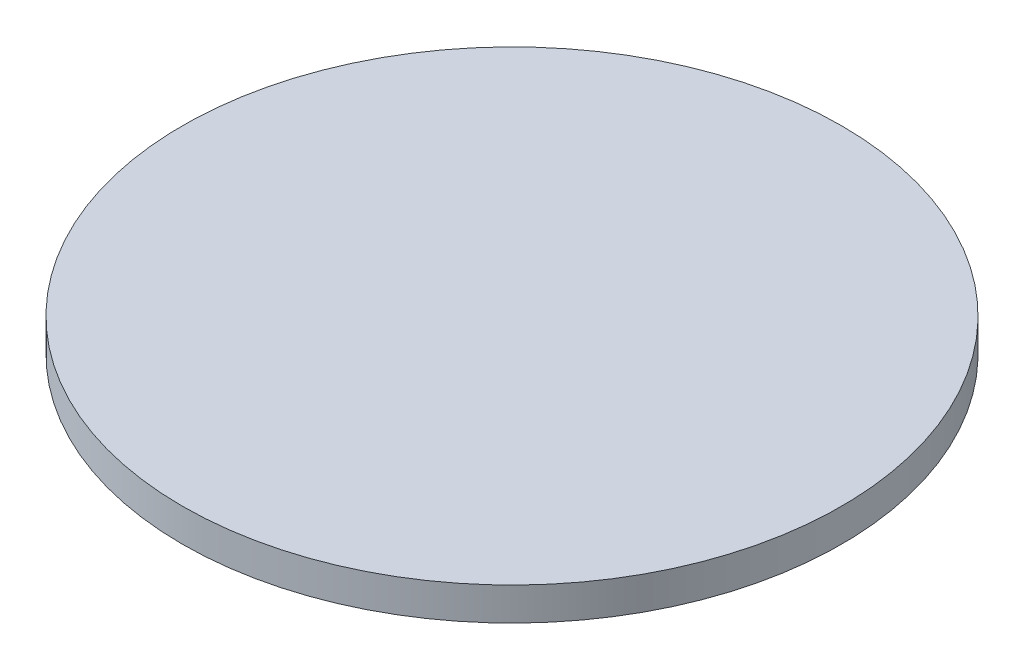
ISO-10303-21;
HEADER;
FILE_DESCRIPTION(('STEP AP214'),'2;1');
FILE_NAME('part.step','',(''),(''),'','','');
FILE_SCHEMA(('AUTOMOTIVE_DESIGN { 1 0 10303 214 1 1 1 1 }'));
ENDSEC;
DATA;
#1=APPLICATION_CONTEXT('core data for automotive mechanical design processes');
#2=APPLICATION_PROTOCOL_DEFINITION('international standard','automotive_design',2000,#1);
#3=PRODUCT_CONTEXT('',#1,'mechanical');
#4=PRODUCT('Part','Part','',(#3));
#5=PRODUCT_RELATED_PRODUCT_CATEGORY('part','',(#4));
#6=PRODUCT_DEFINITION_FORMATION('','',#4);
#7=PRODUCT_DEFINITION_CONTEXT('part definition',#1,'design');
#8=PRODUCT_DEFINITION('design','',#6,#7);
#9=PRODUCT_DEFINITION_SHAPE('','',#8);
#10=(LENGTH_UNIT() NAMED_UNIT(*) SI_UNIT(.MILLI.,.METRE.));
#11=(NAMED_UNIT(*) PLANE_ANGLE_UNIT() SI_UNIT($,.RADIAN.));
#12=(NAMED_UNIT(*) SI_UNIT($,.STERADIAN.) SOLID_ANGLE_UNIT());
#13=UNCERTAINTY_MEASURE_WITH_UNIT(LENGTH_MEASURE(1.E-05),#10,'distance_accuracy_value','');
#14=(GEOMETRIC_REPRESENTATION_CONTEXT(3) GLOBAL_UNCERTAINTY_ASSIGNED_CONTEXT((#13)) GLOBAL_UNIT_ASSIGNED_CONTEXT((#10,
#11,#12)) REPRESENTATION_CONTEXT('',''));
#15=CARTESIAN_POINT('',(0.,0.,0.));
#16=DIRECTION('',(0.,0.,1.));
#17=DIRECTION('',(1.,0.,0.));
#18=AXIS2_PLACEMENT_3D('',#15,#16,#17);
#19=CARTESIAN_POINT('',(0.,5.,0.));
#20=DIRECTION('',(0.,-1.,0.));
#21=DIRECTION('',(0.,0.,-1.));
#22=AXIS2_PLACEMENT_3D('',#19,#20,#21);
#23=CYLINDRICAL_SURFACE('',#22,50.);
#24=CARTESIAN_POINT('',(0.,5.,0.));
#25=DIRECTION('',(0.,1.,0.));
#26=DIRECTION('',(0.,0.,1.));
#27=AXIS2_PLACEMENT_3D('',#24,#25,#26);
#28=CIRCLE('',#27,50.);
#29=CARTESIAN_POINT('',(0.,5.,50.));
#30=VERTEX_POINT('',#29);
#31=EDGE_CURVE('E10',#30,#30,#28,.T.);
#32=ORIENTED_EDGE('',*,*,#31,.F.);
#33=EDGE_LOOP('',(#32));
#34=FACE_BOUND('',#33,.T.);
#35=CARTESIAN_POINT('',(0.,0.,0.));
#36=DIRECTION('',(0.,1.,0.));
#37=DIRECTION('',(0.,0.,1.));
#38=AXIS2_PLACEMENT_3D('',#35,#36,#37);
#39=CIRCLE('',#38,50.);
#40=CARTESIAN_POINT('',(0.,0.,50.));
#41=VERTEX_POINT('',#40);
#42=EDGE_CURVE('E38',#41,#41,#39,.T.);
#43=ORIENTED_EDGE('',*,*,#42,.T.);
#44=EDGE_LOOP('',(#43));
#45=FACE_BOUND('',#44,.T.);
#46=ADVANCED_FACE('F35',(#34,#45),#23,.T.);
#47=CARTESIAN_POINT('',(0.,5.,0.));
#48=DIRECTION('',(0.,1.,0.));
#49=DIRECTION('',(0.,0.,1.));
#50=AXIS2_PLACEMENT_3D('',#47,#48,#49);
#51=PLANE('',#50);
#52=ORIENTED_EDGE('',*,*,#31,.T.);
#53=EDGE_LOOP('',(#52));
#54=FACE_BOUND('',#53,.T.);
#55=ADVANCED_FACE('F50',(#54),#51,.T.);
#56=CARTESIAN_POINT('',(0.,0.,0.));
#57=DIRECTION('',(0.,1.,0.));
#58=DIRECTION('',(0.,0.,1.));
#59=AXIS2_PLACEMENT_3D('',#56,#57,#58);
#60=PLANE('',#59);
#61=ORIENTED_EDGE('',*,*,#42,.F.);
#62=EDGE_LOOP('',(#61));
#63=FACE_BOUND('',#62,.T.);
#64=ADVANCED_FACE('F48',(#63),#60,.F.);
#65=CLOSED_SHELL('',(#46,#55,#64));
#66=MANIFOLD_SOLID_BREP('B2',#65);
#67=ADVANCED_BREP_SHAPE_REPRESENTATION('',(#18,#66),#14);
#68=SHAPE_DEFINITION_REPRESENTATION(#9,#67);
ENDSEC;
END-ISO-10303-21;
